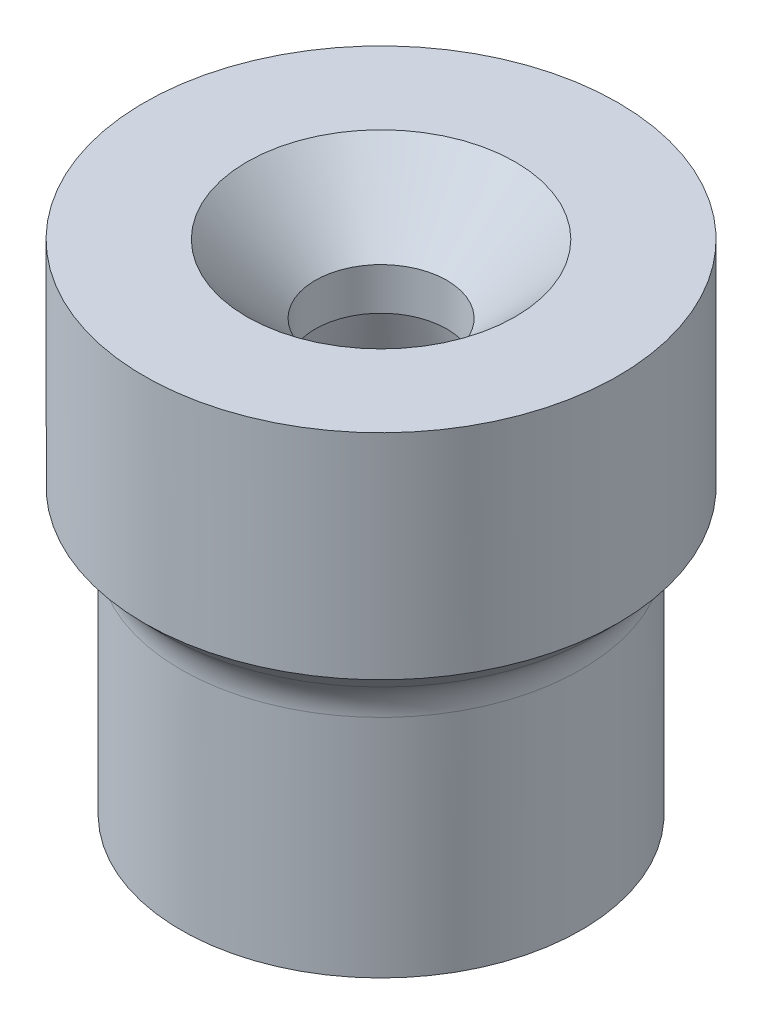
ISO-10303-21;
HEADER;
FILE_DESCRIPTION(('STEP AP214'),'2;1');
FILE_NAME('part.step','',(''),(''),'','','');
FILE_SCHEMA(('AUTOMOTIVE_DESIGN { 1 0 10303 214 1 1 1 1 }'));
ENDSEC;
DATA;
#1=APPLICATION_CONTEXT('core data for automotive mechanical design processes');
#2=APPLICATION_PROTOCOL_DEFINITION('international standard','automotive_design',2000,#1);
#3=PRODUCT_CONTEXT('',#1,'mechanical');
#4=PRODUCT('Part','Part','',(#3));
#5=PRODUCT_RELATED_PRODUCT_CATEGORY('part','',(#4));
#6=PRODUCT_DEFINITION_FORMATION('','',#4);
#7=PRODUCT_DEFINITION_CONTEXT('part definition',#1,'design');
#8=PRODUCT_DEFINITION('design','',#6,#7);
#9=PRODUCT_DEFINITION_SHAPE('','',#8);
#10=(LENGTH_UNIT() NAMED_UNIT(*) SI_UNIT(.MILLI.,.METRE.));
#11=(NAMED_UNIT(*) PLANE_ANGLE_UNIT() SI_UNIT($,.RADIAN.));
#12=(NAMED_UNIT(*) SI_UNIT($,.STERADIAN.) SOLID_ANGLE_UNIT());
#13=UNCERTAINTY_MEASURE_WITH_UNIT(LENGTH_MEASURE(1.E-05),#10,'distance_accuracy_value','');
#14=(GEOMETRIC_REPRESENTATION_CONTEXT(3) GLOBAL_UNCERTAINTY_ASSIGNED_CONTEXT((#13)) GLOBAL_UNIT_ASSIGNED_CONTEXT((#10,
#11,#12)) REPRESENTATION_CONTEXT('',''));
#15=CARTESIAN_POINT('',(0.,0.,0.));
#16=DIRECTION('',(0.,0.,1.));
#17=DIRECTION('',(1.,0.,0.));
#18=AXIS2_PLACEMENT_3D('',#15,#16,#17);
#19=CARTESIAN_POINT('',(0.,0.,0.));
#20=DIRECTION('',(0.,-1.,0.));
#21=DIRECTION('',(0.,0.,-1.));
#22=AXIS2_PLACEMENT_3D('',#19,#20,#21);
#23=CYLINDRICAL_SURFACE('',#22,38.);
#24=CARTESIAN_POINT('',(0.,42.8578643762691,0.));
#25=DIRECTION('',(0.,1.,0.));
#26=DIRECTION('',(0.,0.,1.));
#27=AXIS2_PLACEMENT_3D('',#24,#25,#26);
#28=CIRCLE('',#27,38.);
#29=CARTESIAN_POINT('',(0.,42.8578643762691,38.));
#30=VERTEX_POINT('',#29);
#31=EDGE_CURVE('E10',#30,#30,#28,.F.);
#32=ORIENTED_EDGE('',*,*,#31,.T.);
#33=EDGE_LOOP('',(#32));
#34=FACE_BOUND('',#33,.T.);
#35=CARTESIAN_POINT('',(0.,0.,0.));
#36=DIRECTION('',(0.,-1.,0.));
#37=DIRECTION('',(0.,0.,-1.));
#38=AXIS2_PLACEMENT_3D('',#35,#36,#37);
#39=CIRCLE('',#38,38.);
#40=CARTESIAN_POINT('',(0.,0.,-38.));
#41=VERTEX_POINT('',#40);
#42=EDGE_CURVE('E45',#41,#41,#39,.T.);
#43=ORIENTED_EDGE('',*,*,#42,.F.);
#44=EDGE_LOOP('',(#43));
#45=FACE_BOUND('',#44,.T.);
#46=ADVANCED_FACE('F34',(#34,#45),#23,.T.);
#47=CARTESIAN_POINT('',(0.,94.6405093386117,0.));
#48=DIRECTION('',(0.,-1.,0.));
#49=DIRECTION('',(0.,0.,-1.));
#50=AXIS2_PLACEMENT_3D('',#47,#48,#49);
#51=PLANE('',#50);
#52=CARTESIAN_POINT('',(0.,94.6405093386117,0.));
#53=DIRECTION('',(0.,-1.,0.));
#54=DIRECTION('',(0.,0.,-1.));
#55=AXIS2_PLACEMENT_3D('',#52,#53,#54);
#56=CIRCLE('',#55,25.4903810567666);
#57=CARTESIAN_POINT('',(0.,94.6405093386117,-25.4903810567666));
#58=VERTEX_POINT('',#57);
#59=EDGE_CURVE('E60',#58,#58,#56,.T.);
#60=ORIENTED_EDGE('',*,*,#59,.T.);
#61=EDGE_LOOP('',(#60));
#62=FACE_BOUND('',#61,.T.);
#63=CARTESIAN_POINT('',(0.,94.6405093386117,0.));
#64=DIRECTION('',(0.,-1.,0.));
#65=DIRECTION('',(0.,0.,-1.));
#66=AXIS2_PLACEMENT_3D('',#63,#64,#65);
#67=CIRCLE('',#66,45.);
#68=CARTESIAN_POINT('',(0.,94.6405093386117,-45.));
#69=VERTEX_POINT('',#68);
#70=EDGE_CURVE('E66',#69,#69,#67,.T.);
#71=ORIENTED_EDGE('',*,*,#70,.F.);
#72=EDGE_LOOP('',(#71));
#73=FACE_BOUND('',#72,.T.);
#74=ADVANCED_FACE('F72',(#62,#73),#51,.F.);
#75=CARTESIAN_POINT('',(0.,81.6501282818452,0.));
#76=DIRECTION('',(0.,1.,0.));
#77=DIRECTION('',(0.,0.,1.));
#78=AXIS2_PLACEMENT_3D('',#75,#76,#77);
#79=CONICAL_SURFACE('',#78,12.5,0.78539816339745);
#80=ORIENTED_EDGE('',*,*,#59,.F.);
#81=EDGE_LOOP('',(#80));
#82=FACE_BOUND('',#81,.T.);
#83=CARTESIAN_POINT('',(0.,81.6501282818452,0.));
#84=DIRECTION('',(0.,-1.,0.));
#85=DIRECTION('',(0.,0.,-1.));
#86=AXIS2_PLACEMENT_3D('',#83,#84,#85);
#87=CIRCLE('',#86,12.5);
#88=CARTESIAN_POINT('',(0.,81.6501282818452,-12.5));
#89=VERTEX_POINT('',#88);
#90=EDGE_CURVE('E57',#89,#89,#87,.T.);
#91=ORIENTED_EDGE('',*,*,#90,.T.);
#92=EDGE_LOOP('',(#91));
#93=FACE_BOUND('',#92,.T.);
#94=ADVANCED_FACE('F74',(#82,#93),#79,.F.);
#95=CARTESIAN_POINT('',(0.,0.,0.));
#96=DIRECTION('',(0.,-1.,0.));
#97=DIRECTION('',(0.,0.,-1.));
#98=AXIS2_PLACEMENT_3D('',#95,#96,#97);
#99=CYLINDRICAL_SURFACE('',#98,12.5);
#100=ORIENTED_EDGE('',*,*,#90,.F.);
#101=EDGE_LOOP('',(#100));
#102=FACE_BOUND('',#101,.T.);
#103=CARTESIAN_POINT('',(0.,73.6501282818452,0.));
#104=DIRECTION('',(0.,-1.,0.));
#105=DIRECTION('',(0.,0.,-1.));
#106=AXIS2_PLACEMENT_3D('',#103,#104,#105);
#107=CIRCLE('',#106,12.5);
#108=CARTESIAN_POINT('',(0.,73.6501282818452,-12.5));
#109=VERTEX_POINT('',#108);
#110=EDGE_CURVE('E54',#109,#109,#107,.T.);
#111=ORIENTED_EDGE('',*,*,#110,.T.);
#112=EDGE_LOOP('',(#111));
#113=FACE_BOUND('',#112,.T.);
#114=ADVANCED_FACE('F81',(#102,#113),#99,.F.);
#115=CARTESIAN_POINT('',(0.,0.,0.));
#116=DIRECTION('',(0.,-1.,0.));
#117=DIRECTION('',(0.,0.,-1.));
#118=AXIS2_PLACEMENT_3D('',#115,#116,#117);
#119=CONICAL_SURFACE('',#118,32.2344923955691,0.26179938779915);
#120=ORIENTED_EDGE('',*,*,#110,.F.);
#121=EDGE_LOOP('',(#120));
#122=FACE_BOUND('',#121,.T.);
#123=CARTESIAN_POINT('',(0.,0.,0.));
#124=DIRECTION('',(0.,-1.,0.));
#125=DIRECTION('',(0.,0.,-1.));
#126=AXIS2_PLACEMENT_3D('',#123,#124,#125);
#127=CIRCLE('',#126,32.2344923955691);
#128=CARTESIAN_POINT('',(0.,0.,-32.2344923955691));
#129=VERTEX_POINT('',#128);
#130=EDGE_CURVE('E49',#129,#129,#127,.T.);
#131=ORIENTED_EDGE('',*,*,#130,.T.);
#132=EDGE_LOOP('',(#131));
#133=FACE_BOUND('',#132,.T.);
#134=ADVANCED_FACE('F89',(#122,#133),#119,.F.);
#135=CARTESIAN_POINT('',(0.,0.,0.));
#136=DIRECTION('',(0.,1.,0.));
#137=DIRECTION('',(0.,0.,1.));
#138=AXIS2_PLACEMENT_3D('',#135,#136,#137);
#139=PLANE('',#138);
#140=ORIENTED_EDGE('',*,*,#130,.F.);
#141=EDGE_LOOP('',(#140));
#142=FACE_BOUND('',#141,.T.);
#143=ORIENTED_EDGE('',*,*,#42,.T.);
#144=EDGE_LOOP('',(#143));
#145=FACE_BOUND('',#144,.T.);
#146=ADVANCED_FACE('F93',(#142,#145),#139,.F.);
#147=CARTESIAN_POINT('',(0.,0.,0.));
#148=DIRECTION('',(0.,-1.,0.));
#149=DIRECTION('',(0.,0.,-1.));
#150=AXIS2_PLACEMENT_3D('',#147,#148,#149);
#151=CYLINDRICAL_SURFACE('',#150,45.);
#152=CARTESIAN_POINT('',(0.,54.,0.));
#153=DIRECTION('',(0.,-1.,0.));
#154=DIRECTION('',(0.,0.,-1.));
#155=AXIS2_PLACEMENT_3D('',#152,#153,#154);
#156=CIRCLE('',#155,45.);
#157=CARTESIAN_POINT('',(0.,54.,-45.));
#158=VERTEX_POINT('',#157);
#159=EDGE_CURVE('E63',#158,#158,#156,.T.);
#160=ORIENTED_EDGE('',*,*,#159,.F.);
#161=EDGE_LOOP('',(#160));
#162=FACE_BOUND('',#161,.T.);
#163=ORIENTED_EDGE('',*,*,#70,.T.);
#164=EDGE_LOOP('',(#163));
#165=FACE_BOUND('',#164,.T.);
#166=ADVANCED_FACE('F70',(#162,#165),#151,.T.);
#167=CARTESIAN_POINT('',(0.,54.,0.));
#168=DIRECTION('',(0.,1.,0.));
#169=DIRECTION('',(0.,0.,1.));
#170=AXIS2_PLACEMENT_3D('',#167,#168,#169);
#171=CONICAL_SURFACE('',#170,45.,0.785398163397449);
#172=CARTESIAN_POINT('',(0.,49.9289321881345,0.));
#173=DIRECTION('',(0.,1.,0.));
#174=DIRECTION('',(0.,0.,1.));
#175=AXIS2_PLACEMENT_3D('',#172,#173,#174);
#176=CIRCLE('',#175,40.9289321881345);
#177=CARTESIAN_POINT('',(0.,49.9289321881345,40.9289321881345));
#178=VERTEX_POINT('',#177);
#179=EDGE_CURVE('E41',#178,#178,#176,.T.);
#180=ORIENTED_EDGE('',*,*,#179,.T.);
#181=EDGE_LOOP('',(#180));
#182=FACE_BOUND('',#181,.T.);
#183=ORIENTED_EDGE('',*,*,#159,.T.);
#184=EDGE_LOOP('',(#183));
#185=FACE_BOUND('',#184,.T.);
#186=ADVANCED_FACE('F100',(#182,#185),#171,.T.);
#187=CARTESIAN_POINT('',(0.,42.8578643762691,0.));
#188=DIRECTION('',(0.,1.,0.));
#189=DIRECTION('',(0.,0.,1.));
#190=AXIS2_PLACEMENT_3D('',#187,#188,#189);
#191=TOROIDAL_SURFACE('',#190,48.,10.);
#192=ORIENTED_EDGE('',*,*,#31,.F.);
#193=EDGE_LOOP('',(#192));
#194=FACE_BOUND('',#193,.T.);
#195=ORIENTED_EDGE('',*,*,#179,.F.);
#196=EDGE_LOOP('',(#195));
#197=FACE_BOUND('',#196,.T.);
#198=ADVANCED_FACE('F36',(#194,#197),#191,.F.);
#199=CLOSED_SHELL('',(#46,#74,#94,#114,#134,#146,#166,#186,#198));
#200=MANIFOLD_SOLID_BREP('B2',#199);
#201=ADVANCED_BREP_SHAPE_REPRESENTATION('',(#18,#200),#14);
#202=SHAPE_DEFINITION_REPRESENTATION(#9,#201);
ENDSEC;
END-ISO-10303-21;
